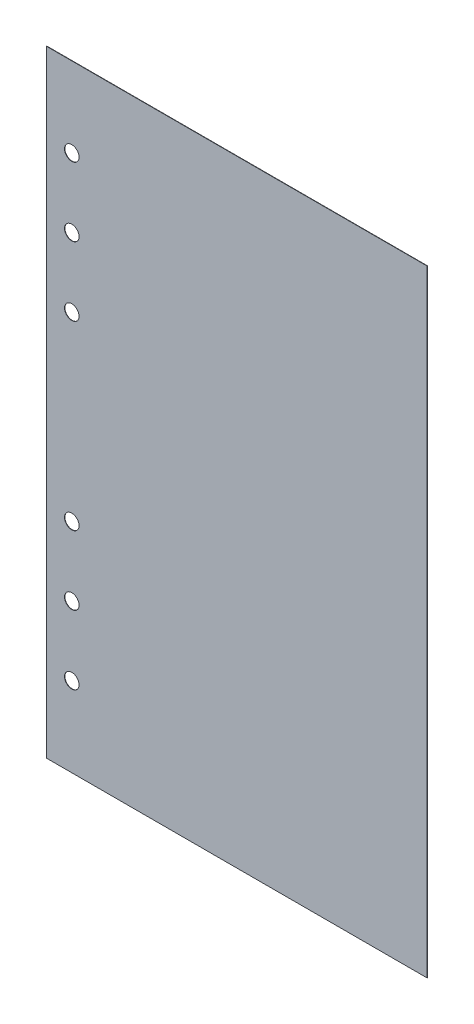
ISO-10303-21;
HEADER;
FILE_DESCRIPTION(('STEP AP214'),'2;1');
FILE_NAME('part.step','',(''),(''),'','','');
FILE_SCHEMA(('AUTOMOTIVE_DESIGN { 1 0 10303 214 1 1 1 1 }'));
ENDSEC;
DATA;
#1=APPLICATION_CONTEXT('core data for automotive mechanical design processes');
#2=APPLICATION_PROTOCOL_DEFINITION('international standard','automotive_design',2000,#1);
#3=PRODUCT_CONTEXT('',#1,'mechanical');
#4=PRODUCT('Part','Part','',(#3));
#5=PRODUCT_RELATED_PRODUCT_CATEGORY('part','',(#4));
#6=PRODUCT_DEFINITION_FORMATION('','',#4);
#7=PRODUCT_DEFINITION_CONTEXT('part definition',#1,'design');
#8=PRODUCT_DEFINITION('design','',#6,#7);
#9=PRODUCT_DEFINITION_SHAPE('','',#8);
#10=(LENGTH_UNIT() NAMED_UNIT(*) SI_UNIT(.MILLI.,.METRE.));
#11=(NAMED_UNIT(*) PLANE_ANGLE_UNIT() SI_UNIT($,.RADIAN.));
#12=(NAMED_UNIT(*) SI_UNIT($,.STERADIAN.) SOLID_ANGLE_UNIT());
#13=UNCERTAINTY_MEASURE_WITH_UNIT(LENGTH_MEASURE(1.E-05),#10,'distance_accuracy_value','');
#14=(GEOMETRIC_REPRESENTATION_CONTEXT(3) GLOBAL_UNCERTAINTY_ASSIGNED_CONTEXT((#13)) GLOBAL_UNIT_ASSIGNED_CONTEXT((#10,
#11,#12)) REPRESENTATION_CONTEXT('',''));
#15=CARTESIAN_POINT('',(0.,0.,0.));
#16=DIRECTION('',(0.,0.,1.));
#17=DIRECTION('',(1.,0.,0.));
#18=AXIS2_PLACEMENT_3D('',#15,#16,#17);
#19=CARTESIAN_POINT('',(0.,0.,0.1));
#20=DIRECTION('',(0.,0.,-1.));
#21=DIRECTION('',(-1.,0.,0.));
#22=AXIS2_PLACEMENT_3D('',#19,#20,#21);
#23=PLANE('',#22);
#24=DIRECTION('',(0.,-1.,0.));
#25=VECTOR('',#24,1.);
#26=CARTESIAN_POINT('',(0.,0.,0.1));
#27=LINE('',#26,#25);
#28=CARTESIAN_POINT('',(0.,170.,0.1));
#29=VERTEX_POINT('',#28);
#30=CARTESIAN_POINT('',(0.,0.,0.1));
#31=VERTEX_POINT('',#30);
#32=EDGE_CURVE('E84',#29,#31,#27,.T.);
#33=ORIENTED_EDGE('',*,*,#32,.T.);
#34=DIRECTION('',(1.,0.,0.));
#35=VECTOR('',#34,1.);
#36=CARTESIAN_POINT('',(0.,0.,0.1));
#37=LINE('',#36,#35);
#38=CARTESIAN_POINT('',(105.,0.,0.1));
#39=VERTEX_POINT('',#38);
#40=EDGE_CURVE('E79',#31,#39,#37,.T.);
#41=ORIENTED_EDGE('',*,*,#40,.T.);
#42=DIRECTION('',(0.,1.,0.));
#43=VECTOR('',#42,1.);
#44=CARTESIAN_POINT('',(105.,0.,0.1));
#45=LINE('',#44,#43);
#46=CARTESIAN_POINT('',(105.,170.,0.1));
#47=VERTEX_POINT('',#46);
#48=EDGE_CURVE('E82',#39,#47,#45,.T.);
#49=ORIENTED_EDGE('',*,*,#48,.T.);
#50=DIRECTION('',(-1.,0.,0.));
#51=VECTOR('',#50,1.);
#52=CARTESIAN_POINT('',(0.,170.,0.1));
#53=LINE('',#52,#51);
#54=EDGE_CURVE('E49',#47,#29,#53,.T.);
#55=ORIENTED_EDGE('',*,*,#54,.T.);
#56=EDGE_LOOP('',(#33,#41,#49,#55));
#57=FACE_BOUND('',#56,.T.);
#58=CARTESIAN_POINT('',(7.,110.,0.1));
#59=DIRECTION('',(0.,0.,1.));
#60=DIRECTION('',(1.,0.,0.));
#61=AXIS2_PLACEMENT_3D('',#58,#59,#60);
#62=CIRCLE('',#61,2.);
#63=CARTESIAN_POINT('',(9.,110.,0.1));
#64=VERTEX_POINT('',#63);
#65=EDGE_CURVE('E99',#64,#64,#62,.T.);
#66=ORIENTED_EDGE('',*,*,#65,.F.);
#67=EDGE_LOOP('',(#66));
#68=FACE_BOUND('',#67,.T.);
#69=CARTESIAN_POINT('',(7.,129.,0.1));
#70=DIRECTION('',(0.,0.,1.));
#71=DIRECTION('',(1.,0.,0.));
#72=AXIS2_PLACEMENT_3D('',#69,#70,#71);
#73=CIRCLE('',#72,2.);
#74=CARTESIAN_POINT('',(9.,129.,0.1));
#75=VERTEX_POINT('',#74);
#76=EDGE_CURVE('E114',#75,#75,#73,.T.);
#77=ORIENTED_EDGE('',*,*,#76,.F.);
#78=EDGE_LOOP('',(#77));
#79=FACE_BOUND('',#78,.T.);
#80=CARTESIAN_POINT('',(7.,148.,0.1));
#81=DIRECTION('',(0.,0.,1.));
#82=DIRECTION('',(1.,0.,0.));
#83=AXIS2_PLACEMENT_3D('',#80,#81,#82);
#84=CIRCLE('',#83,2.);
#85=CARTESIAN_POINT('',(9.,148.,0.1));
#86=VERTEX_POINT('',#85);
#87=EDGE_CURVE('E120',#86,#86,#84,.T.);
#88=ORIENTED_EDGE('',*,*,#87,.F.);
#89=EDGE_LOOP('',(#88));
#90=FACE_BOUND('',#89,.T.);
#91=CARTESIAN_POINT('',(7.,22.,0.1));
#92=DIRECTION('',(0.,0.,1.));
#93=DIRECTION('',(-1.,0.,0.));
#94=AXIS2_PLACEMENT_3D('',#91,#92,#93);
#95=CIRCLE('',#94,2.);
#96=CARTESIAN_POINT('',(5.,22.,0.1));
#97=VERTEX_POINT('',#96);
#98=EDGE_CURVE('E126',#97,#97,#95,.T.);
#99=ORIENTED_EDGE('',*,*,#98,.F.);
#100=EDGE_LOOP('',(#99));
#101=FACE_BOUND('',#100,.T.);
#102=CARTESIAN_POINT('',(7.,41.,0.1));
#103=DIRECTION('',(0.,0.,1.));
#104=DIRECTION('',(-1.,0.,0.));
#105=AXIS2_PLACEMENT_3D('',#102,#103,#104);
#106=CIRCLE('',#105,2.);
#107=CARTESIAN_POINT('',(5.,41.,0.1));
#108=VERTEX_POINT('',#107);
#109=EDGE_CURVE('E132',#108,#108,#106,.T.);
#110=ORIENTED_EDGE('',*,*,#109,.F.);
#111=EDGE_LOOP('',(#110));
#112=FACE_BOUND('',#111,.T.);
#113=CARTESIAN_POINT('',(7.,60.,0.1));
#114=DIRECTION('',(0.,0.,1.));
#115=DIRECTION('',(-1.,0.,0.));
#116=AXIS2_PLACEMENT_3D('',#113,#114,#115);
#117=CIRCLE('',#116,2.);
#118=CARTESIAN_POINT('',(5.00000000000001,60.,0.1));
#119=VERTEX_POINT('',#118);
#120=EDGE_CURVE('E138',#119,#119,#117,.T.);
#121=ORIENTED_EDGE('',*,*,#120,.F.);
#122=EDGE_LOOP('',(#121));
#123=FACE_BOUND('',#122,.T.);
#124=ADVANCED_FACE('F32',(#57,#68,#79,#90,#101,#112,#123),#23,.F.);
#125=CARTESIAN_POINT('',(0.,0.,0.));
#126=DIRECTION('',(0.,0.,-1.));
#127=DIRECTION('',(-1.,0.,0.));
#128=AXIS2_PLACEMENT_3D('',#125,#126,#127);
#129=PLANE('',#128);
#130=CARTESIAN_POINT('',(7.,41.,0.));
#131=DIRECTION('',(0.,0.,1.));
#132=DIRECTION('',(-1.,0.,0.));
#133=AXIS2_PLACEMENT_3D('',#130,#131,#132);
#134=CIRCLE('',#133,2.);
#135=CARTESIAN_POINT('',(5.,41.,0.));
#136=VERTEX_POINT('',#135);
#137=EDGE_CURVE('E135',#136,#136,#134,.T.);
#138=ORIENTED_EDGE('',*,*,#137,.T.);
#139=EDGE_LOOP('',(#138));
#140=FACE_BOUND('',#139,.T.);
#141=CARTESIAN_POINT('',(7.,148.,0.));
#142=DIRECTION('',(0.,0.,1.));
#143=DIRECTION('',(1.,0.,0.));
#144=AXIS2_PLACEMENT_3D('',#141,#142,#143);
#145=CIRCLE('',#144,2.);
#146=CARTESIAN_POINT('',(9.,148.,0.));
#147=VERTEX_POINT('',#146);
#148=EDGE_CURVE('E123',#147,#147,#145,.T.);
#149=ORIENTED_EDGE('',*,*,#148,.T.);
#150=EDGE_LOOP('',(#149));
#151=FACE_BOUND('',#150,.T.);
#152=CARTESIAN_POINT('',(7.,110.,0.));
#153=DIRECTION('',(0.,0.,1.));
#154=DIRECTION('',(1.,0.,0.));
#155=AXIS2_PLACEMENT_3D('',#152,#153,#154);
#156=CIRCLE('',#155,2.);
#157=CARTESIAN_POINT('',(9.,110.,0.));
#158=VERTEX_POINT('',#157);
#159=EDGE_CURVE('E111',#158,#158,#156,.T.);
#160=ORIENTED_EDGE('',*,*,#159,.T.);
#161=EDGE_LOOP('',(#160));
#162=FACE_BOUND('',#161,.T.);
#163=DIRECTION('',(0.,-1.,0.));
#164=VECTOR('',#163,1.);
#165=CARTESIAN_POINT('',(0.,0.,0.));
#166=LINE('',#165,#164);
#167=CARTESIAN_POINT('',(0.,170.,0.));
#168=VERTEX_POINT('',#167);
#169=CARTESIAN_POINT('',(0.,0.,0.));
#170=VERTEX_POINT('',#169);
#171=EDGE_CURVE('E96',#168,#170,#166,.T.);
#172=ORIENTED_EDGE('',*,*,#171,.F.);
#173=DIRECTION('',(-1.,0.,0.));
#174=VECTOR('',#173,1.);
#175=CARTESIAN_POINT('',(0.,170.,0.));
#176=LINE('',#175,#174);
#177=CARTESIAN_POINT('',(105.,170.,0.));
#178=VERTEX_POINT('',#177);
#179=EDGE_CURVE('E72',#178,#168,#176,.T.);
#180=ORIENTED_EDGE('',*,*,#179,.F.);
#181=DIRECTION('',(0.,1.,0.));
#182=VECTOR('',#181,1.);
#183=CARTESIAN_POINT('',(105.,0.,0.));
#184=LINE('',#183,#182);
#185=CARTESIAN_POINT('',(105.,0.,0.));
#186=VERTEX_POINT('',#185);
#187=EDGE_CURVE('E66',#186,#178,#184,.T.);
#188=ORIENTED_EDGE('',*,*,#187,.F.);
#189=DIRECTION('',(1.,0.,0.));
#190=VECTOR('',#189,1.);
#191=CARTESIAN_POINT('',(0.,0.,0.));
#192=LINE('',#191,#190);
#193=EDGE_CURVE('E88',#170,#186,#192,.T.);
#194=ORIENTED_EDGE('',*,*,#193,.F.);
#195=EDGE_LOOP('',(#172,#180,#188,#194));
#196=FACE_BOUND('',#195,.T.);
#197=CARTESIAN_POINT('',(7.,129.,0.));
#198=DIRECTION('',(0.,0.,1.));
#199=DIRECTION('',(1.,0.,0.));
#200=AXIS2_PLACEMENT_3D('',#197,#198,#199);
#201=CIRCLE('',#200,2.);
#202=CARTESIAN_POINT('',(9.,129.,0.));
#203=VERTEX_POINT('',#202);
#204=EDGE_CURVE('E117',#203,#203,#201,.T.);
#205=ORIENTED_EDGE('',*,*,#204,.T.);
#206=EDGE_LOOP('',(#205));
#207=FACE_BOUND('',#206,.T.);
#208=CARTESIAN_POINT('',(7.,22.,0.));
#209=DIRECTION('',(0.,0.,1.));
#210=DIRECTION('',(-1.,0.,0.));
#211=AXIS2_PLACEMENT_3D('',#208,#209,#210);
#212=CIRCLE('',#211,2.);
#213=CARTESIAN_POINT('',(5.,22.,0.));
#214=VERTEX_POINT('',#213);
#215=EDGE_CURVE('E129',#214,#214,#212,.T.);
#216=ORIENTED_EDGE('',*,*,#215,.T.);
#217=EDGE_LOOP('',(#216));
#218=FACE_BOUND('',#217,.T.);
#219=CARTESIAN_POINT('',(7.,60.,0.));
#220=DIRECTION('',(0.,0.,1.));
#221=DIRECTION('',(-1.,0.,0.));
#222=AXIS2_PLACEMENT_3D('',#219,#220,#221);
#223=CIRCLE('',#222,2.);
#224=CARTESIAN_POINT('',(5.00000000000001,60.,0.));
#225=VERTEX_POINT('',#224);
#226=EDGE_CURVE('E141',#225,#225,#223,.T.);
#227=ORIENTED_EDGE('',*,*,#226,.T.);
#228=EDGE_LOOP('',(#227));
#229=FACE_BOUND('',#228,.T.);
#230=ADVANCED_FACE('F107',(#140,#151,#162,#196,#207,#218,#229),#129,.T.);
#231=CARTESIAN_POINT('',(0.,0.,0.1));
#232=DIRECTION('',(1.,0.,0.));
#233=DIRECTION('',(0.,0.,-1.));
#234=AXIS2_PLACEMENT_3D('',#231,#232,#233);
#235=PLANE('',#234);
#236=ORIENTED_EDGE('',*,*,#171,.T.);
#237=DIRECTION('',(0.,0.,-1.));
#238=VECTOR('',#237,1.);
#239=CARTESIAN_POINT('',(0.,0.,0.1));
#240=LINE('',#239,#238);
#241=EDGE_CURVE('E11',#31,#170,#240,.T.);
#242=ORIENTED_EDGE('',*,*,#241,.F.);
#243=ORIENTED_EDGE('',*,*,#32,.F.);
#244=DIRECTION('',(0.,0.,-1.));
#245=VECTOR('',#244,1.);
#246=CARTESIAN_POINT('',(0.,170.,0.1));
#247=LINE('',#246,#245);
#248=EDGE_CURVE('E92',#29,#168,#247,.T.);
#249=ORIENTED_EDGE('',*,*,#248,.T.);
#250=EDGE_LOOP('',(#236,#242,#243,#249));
#251=FACE_BOUND('',#250,.T.);
#252=ADVANCED_FACE('F34',(#251),#235,.F.);
#253=CARTESIAN_POINT('',(0.,0.,0.1));
#254=DIRECTION('',(0.,1.,0.));
#255=DIRECTION('',(0.,0.,1.));
#256=AXIS2_PLACEMENT_3D('',#253,#254,#255);
#257=PLANE('',#256);
#258=ORIENTED_EDGE('',*,*,#193,.T.);
#259=DIRECTION('',(0.,0.,-1.));
#260=VECTOR('',#259,1.);
#261=CARTESIAN_POINT('',(105.,0.,0.1));
#262=LINE('',#261,#260);
#263=EDGE_CURVE('E41',#39,#186,#262,.T.);
#264=ORIENTED_EDGE('',*,*,#263,.F.);
#265=ORIENTED_EDGE('',*,*,#40,.F.);
#266=ORIENTED_EDGE('',*,*,#241,.T.);
#267=EDGE_LOOP('',(#258,#264,#265,#266));
#268=FACE_BOUND('',#267,.T.);
#269=ADVANCED_FACE('F87',(#268),#257,.F.);
#270=CARTESIAN_POINT('',(105.,0.,0.1));
#271=DIRECTION('',(-1.,0.,0.));
#272=DIRECTION('',(0.,0.,1.));
#273=AXIS2_PLACEMENT_3D('',#270,#271,#272);
#274=PLANE('',#273);
#275=ORIENTED_EDGE('',*,*,#187,.T.);
#276=DIRECTION('',(0.,0.,-1.));
#277=VECTOR('',#276,1.);
#278=CARTESIAN_POINT('',(105.,170.,0.1));
#279=LINE('',#278,#277);
#280=EDGE_CURVE('E89',#47,#178,#279,.T.);
#281=ORIENTED_EDGE('',*,*,#280,.F.);
#282=ORIENTED_EDGE('',*,*,#48,.F.);
#283=ORIENTED_EDGE('',*,*,#263,.T.);
#284=EDGE_LOOP('',(#275,#281,#282,#283));
#285=FACE_BOUND('',#284,.T.);
#286=ADVANCED_FACE('F90',(#285),#274,.F.);
#287=CARTESIAN_POINT('',(0.,170.,0.1));
#288=DIRECTION('',(0.,-1.,0.));
#289=DIRECTION('',(0.,0.,-1.));
#290=AXIS2_PLACEMENT_3D('',#287,#288,#289);
#291=PLANE('',#290);
#292=ORIENTED_EDGE('',*,*,#179,.T.);
#293=ORIENTED_EDGE('',*,*,#248,.F.);
#294=ORIENTED_EDGE('',*,*,#54,.F.);
#295=ORIENTED_EDGE('',*,*,#280,.T.);
#296=EDGE_LOOP('',(#292,#293,#294,#295));
#297=FACE_BOUND('',#296,.T.);
#298=ADVANCED_FACE('F104',(#297),#291,.F.);
#299=CARTESIAN_POINT('',(7.,110.,0.1));
#300=DIRECTION('',(0.,0.,-1.));
#301=DIRECTION('',(-1.,0.,0.));
#302=AXIS2_PLACEMENT_3D('',#299,#300,#301);
#303=CYLINDRICAL_SURFACE('',#302,2.);
#304=ORIENTED_EDGE('',*,*,#65,.T.);
#305=EDGE_LOOP('',(#304));
#306=FACE_BOUND('',#305,.T.);
#307=ORIENTED_EDGE('',*,*,#159,.F.);
#308=EDGE_LOOP('',(#307));
#309=FACE_BOUND('',#308,.T.);
#310=ADVANCED_FACE('F158',(#306,#309),#303,.F.);
#311=CARTESIAN_POINT('',(7.,129.,0.1));
#312=DIRECTION('',(0.,0.,-1.));
#313=DIRECTION('',(-1.,0.,0.));
#314=AXIS2_PLACEMENT_3D('',#311,#312,#313);
#315=CYLINDRICAL_SURFACE('',#314,2.);
#316=ORIENTED_EDGE('',*,*,#76,.T.);
#317=EDGE_LOOP('',(#316));
#318=FACE_BOUND('',#317,.T.);
#319=ORIENTED_EDGE('',*,*,#204,.F.);
#320=EDGE_LOOP('',(#319));
#321=FACE_BOUND('',#320,.T.);
#322=ADVANCED_FACE('F204',(#318,#321),#315,.F.);
#323=CARTESIAN_POINT('',(7.,148.,0.1));
#324=DIRECTION('',(0.,0.,-1.));
#325=DIRECTION('',(-1.,0.,0.));
#326=AXIS2_PLACEMENT_3D('',#323,#324,#325);
#327=CYLINDRICAL_SURFACE('',#326,2.);
#328=ORIENTED_EDGE('',*,*,#87,.T.);
#329=EDGE_LOOP('',(#328));
#330=FACE_BOUND('',#329,.T.);
#331=ORIENTED_EDGE('',*,*,#148,.F.);
#332=EDGE_LOOP('',(#331));
#333=FACE_BOUND('',#332,.T.);
#334=ADVANCED_FACE('F212',(#330,#333),#327,.F.);
#335=CARTESIAN_POINT('',(7.,22.,0.1));
#336=DIRECTION('',(0.,0.,-1.));
#337=DIRECTION('',(-1.,0.,0.));
#338=AXIS2_PLACEMENT_3D('',#335,#336,#337);
#339=CYLINDRICAL_SURFACE('',#338,2.);
#340=ORIENTED_EDGE('',*,*,#98,.T.);
#341=EDGE_LOOP('',(#340));
#342=FACE_BOUND('',#341,.T.);
#343=ORIENTED_EDGE('',*,*,#215,.F.);
#344=EDGE_LOOP('',(#343));
#345=FACE_BOUND('',#344,.T.);
#346=ADVANCED_FACE('F220',(#342,#345),#339,.F.);
#347=CARTESIAN_POINT('',(7.,41.,0.1));
#348=DIRECTION('',(0.,0.,-1.));
#349=DIRECTION('',(-1.,0.,0.));
#350=AXIS2_PLACEMENT_3D('',#347,#348,#349);
#351=CYLINDRICAL_SURFACE('',#350,2.);
#352=ORIENTED_EDGE('',*,*,#109,.T.);
#353=EDGE_LOOP('',(#352));
#354=FACE_BOUND('',#353,.T.);
#355=ORIENTED_EDGE('',*,*,#137,.F.);
#356=EDGE_LOOP('',(#355));
#357=FACE_BOUND('',#356,.T.);
#358=ADVANCED_FACE('F229',(#354,#357),#351,.F.);
#359=CARTESIAN_POINT('',(7.,60.,0.1));
#360=DIRECTION('',(0.,0.,-1.));
#361=DIRECTION('',(-1.,0.,0.));
#362=AXIS2_PLACEMENT_3D('',#359,#360,#361);
#363=CYLINDRICAL_SURFACE('',#362,2.);
#364=ORIENTED_EDGE('',*,*,#120,.T.);
#365=EDGE_LOOP('',(#364));
#366=FACE_BOUND('',#365,.T.);
#367=ORIENTED_EDGE('',*,*,#226,.F.);
#368=EDGE_LOOP('',(#367));
#369=FACE_BOUND('',#368,.T.);
#370=ADVANCED_FACE('F147',(#366,#369),#363,.F.);
#371=CLOSED_SHELL('',(#124,#230,#252,#269,#286,#298,#310,#322,#334,#346,#358,#370));
#372=MANIFOLD_SOLID_BREP('B2',#371);
#373=ADVANCED_BREP_SHAPE_REPRESENTATION('',(#18,#372),#14);
#374=SHAPE_DEFINITION_REPRESENTATION(#9,#373);
ENDSEC;
END-ISO-10303-21;
